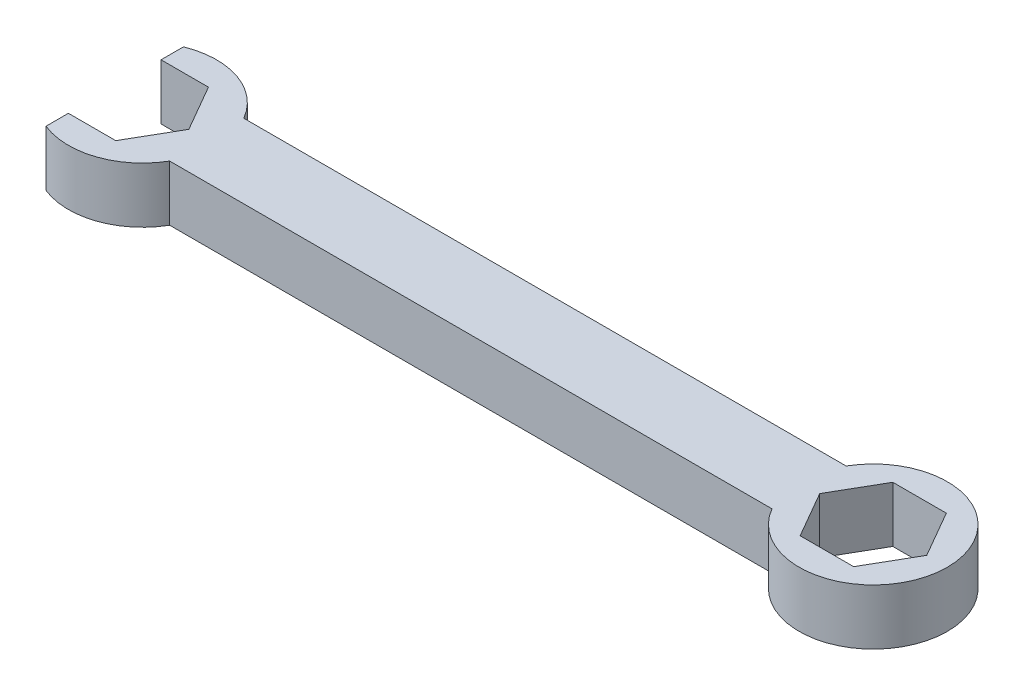
ISO-10303-21;
HEADER;
FILE_DESCRIPTION(('STEP AP214'),'2;1');
FILE_NAME('part.step','',(''),(''),'','','');
FILE_SCHEMA(('AUTOMOTIVE_DESIGN { 1 0 10303 214 1 1 1 1 }'));
ENDSEC;
DATA;
#1=APPLICATION_CONTEXT('core data for automotive mechanical design processes');
#2=APPLICATION_PROTOCOL_DEFINITION('international standard','automotive_design',2000,#1);
#3=PRODUCT_CONTEXT('',#1,'mechanical');
#4=PRODUCT('Part','Part','',(#3));
#5=PRODUCT_RELATED_PRODUCT_CATEGORY('part','',(#4));
#6=PRODUCT_DEFINITION_FORMATION('','',#4);
#7=PRODUCT_DEFINITION_CONTEXT('part definition',#1,'design');
#8=PRODUCT_DEFINITION('design','',#6,#7);
#9=PRODUCT_DEFINITION_SHAPE('','',#8);
#10=(LENGTH_UNIT() NAMED_UNIT(*) SI_UNIT(.MILLI.,.METRE.));
#11=(NAMED_UNIT(*) PLANE_ANGLE_UNIT() SI_UNIT($,.RADIAN.));
#12=(NAMED_UNIT(*) SI_UNIT($,.STERADIAN.) SOLID_ANGLE_UNIT());
#13=UNCERTAINTY_MEASURE_WITH_UNIT(LENGTH_MEASURE(1.E-05),#10,'distance_accuracy_value','');
#14=(GEOMETRIC_REPRESENTATION_CONTEXT(3) GLOBAL_UNCERTAINTY_ASSIGNED_CONTEXT((#13)) GLOBAL_UNIT_ASSIGNED_CONTEXT((#10,
#11,#12)) REPRESENTATION_CONTEXT('',''));
#15=CARTESIAN_POINT('',(0.,0.,0.));
#16=DIRECTION('',(0.,0.,1.));
#17=DIRECTION('',(1.,0.,0.));
#18=AXIS2_PLACEMENT_3D('',#15,#16,#17);
#19=CARTESIAN_POINT('',(-22.6821322748836,7.62,0.));
#20=DIRECTION('',(0.,1.,0.));
#21=DIRECTION('',(0.,0.,1.));
#22=AXIS2_PLACEMENT_3D('',#19,#20,#21);
#23=PLANE('',#22);
#24=DIRECTION('',(0.,0.,1.));
#25=VECTOR('',#24,1.);
#26=CARTESIAN_POINT('',(-26.4921322748836,7.62,-9.41857207861149));
#27=LINE('',#26,#25);
#28=CARTESIAN_POINT('',(-26.4921322748836,7.62,-9.41857207861149));
#29=VERTEX_POINT('',#28);
#30=CARTESIAN_POINT('',(-26.4921322748836,7.62,-6.34999999999999));
#31=VERTEX_POINT('',#30);
#32=EDGE_CURVE('E207',#29,#31,#27,.T.);
#33=ORIENTED_EDGE('',*,*,#32,.T.);
#34=DIRECTION('',(1.,0.,0.));
#35=VECTOR('',#34,1.);
#36=CARTESIAN_POINT('',(-19.9983064842377,7.62,-6.34999999999999));
#37=LINE('',#36,#35);
#38=CARTESIAN_POINT('',(-19.9983064842377,7.62,-6.34999999999999));
#39=VERTEX_POINT('',#38);
#40=EDGE_CURVE('E210',#31,#39,#37,.T.);
#41=ORIENTED_EDGE('',*,*,#40,.T.);
#42=DIRECTION('',(0.5,0.,0.866025403784438));
#43=VECTOR('',#42,1.);
#44=CARTESIAN_POINT('',(-16.3321322748836,7.62,0.));
#45=LINE('',#44,#43);
#46=CARTESIAN_POINT('',(-16.3321322748836,7.62,0.));
#47=VERTEX_POINT('',#46);
#48=EDGE_CURVE('E213',#39,#47,#45,.T.);
#49=ORIENTED_EDGE('',*,*,#48,.T.);
#50=DIRECTION('',(-0.5,0.,0.866025403784439));
#51=VECTOR('',#50,1.);
#52=CARTESIAN_POINT('',(-19.9983064842377,7.62,6.35));
#53=LINE('',#52,#51);
#54=CARTESIAN_POINT('',(-19.9983064842377,7.62,6.35));
#55=VERTEX_POINT('',#54);
#56=EDGE_CURVE('E215',#47,#55,#53,.T.);
#57=ORIENTED_EDGE('',*,*,#56,.T.);
#58=DIRECTION('',(-1.,0.,0.));
#59=VECTOR('',#58,1.);
#60=CARTESIAN_POINT('',(-19.9983064842377,7.62,6.35));
#61=LINE('',#60,#59);
#62=CARTESIAN_POINT('',(-26.4921322748836,7.62,6.35));
#63=VERTEX_POINT('',#62);
#64=EDGE_CURVE('E217',#55,#63,#61,.T.);
#65=ORIENTED_EDGE('',*,*,#64,.T.);
#66=DIRECTION('',(0.,0.,1.));
#67=VECTOR('',#66,1.);
#68=CARTESIAN_POINT('',(-26.4921322748836,7.62,6.35));
#69=LINE('',#68,#67);
#70=CARTESIAN_POINT('',(-26.4921322748836,7.62,9.41857207861149));
#71=VERTEX_POINT('',#70);
#72=EDGE_CURVE('E219',#63,#71,#69,.T.);
#73=ORIENTED_EDGE('',*,*,#72,.T.);
#74=CARTESIAN_POINT('',(-22.6821322748836,7.62,0.));
#75=DIRECTION('',(0.,1.,0.));
#76=DIRECTION('',(0.,0.,1.));
#77=AXIS2_PLACEMENT_3D('',#74,#75,#76);
#78=CIRCLE('',#77,10.16);
#79=CARTESIAN_POINT('',(-13.8833141724337,7.62,5.08));
#80=VERTEX_POINT('',#79);
#81=EDGE_CURVE('E221',#71,#80,#78,.T.);
#82=ORIENTED_EDGE('',*,*,#81,.T.);
#83=DIRECTION('',(1.,0.,0.));
#84=VECTOR('',#83,1.);
#85=CARTESIAN_POINT('',(-13.8833141724337,7.62,5.08));
#86=LINE('',#85,#84);
#87=CARTESIAN_POINT('',(68.6666858275663,7.62,5.07999999999999));
#88=VERTEX_POINT('',#87);
#89=EDGE_CURVE('E223',#80,#88,#86,.T.);
#90=ORIENTED_EDGE('',*,*,#89,.T.);
#91=CARTESIAN_POINT('',(77.4655039300162,7.62,0.));
#92=DIRECTION('',(0.,1.,0.));
#93=DIRECTION('',(0.,0.,1.));
#94=AXIS2_PLACEMENT_3D('',#91,#92,#93);
#95=CIRCLE('',#94,10.16);
#96=CARTESIAN_POINT('',(68.6666858275663,7.62,-5.08000000000002));
#97=VERTEX_POINT('',#96);
#98=EDGE_CURVE('E225',#88,#97,#95,.T.);
#99=ORIENTED_EDGE('',*,*,#98,.T.);
#100=DIRECTION('',(-1.,0.,0.));
#101=VECTOR('',#100,1.);
#102=CARTESIAN_POINT('',(-13.8833141724337,7.62,-5.08));
#103=LINE('',#102,#101);
#104=CARTESIAN_POINT('',(-13.8833141724337,7.62,-5.08));
#105=VERTEX_POINT('',#104);
#106=EDGE_CURVE('E227',#97,#105,#103,.T.);
#107=ORIENTED_EDGE('',*,*,#106,.T.);
#108=CARTESIAN_POINT('',(-22.6821322748836,7.62,0.));
#109=DIRECTION('',(0.,1.,0.));
#110=DIRECTION('',(0.,0.,1.));
#111=AXIS2_PLACEMENT_3D('',#108,#109,#110);
#112=CIRCLE('',#111,10.16);
#113=EDGE_CURVE('E229',#105,#29,#112,.T.);
#114=ORIENTED_EDGE('',*,*,#113,.T.);
#115=EDGE_LOOP('',(#33,#41,#49,#57,#65,#73,#82,#90,#99,#107,#114));
#116=FACE_BOUND('',#115,.T.);
#117=DIRECTION('',(0.499999999999999,0.,0.866025403784439));
#118=VECTOR('',#117,1.);
#119=CARTESIAN_POINT('',(70.1331555113079,7.62,0.));
#120=LINE('',#119,#118);
#121=CARTESIAN_POINT('',(70.1331555113079,7.62,0.));
#122=VERTEX_POINT('',#121);
#123=CARTESIAN_POINT('',(73.7993297206621,7.62,6.34999999999999));
#124=VERTEX_POINT('',#123);
#125=EDGE_CURVE('E164',#122,#124,#120,.T.);
#126=ORIENTED_EDGE('',*,*,#125,.F.);
#127=DIRECTION('',(-0.5,0.,0.866025403784439));
#128=VECTOR('',#127,1.);
#129=CARTESIAN_POINT('',(73.7993297206621,7.62,-6.35000000000001));
#130=LINE('',#129,#128);
#131=CARTESIAN_POINT('',(73.7993297206621,7.62,-6.35000000000001));
#132=VERTEX_POINT('',#131);
#133=EDGE_CURVE('E156',#132,#122,#130,.T.);
#134=ORIENTED_EDGE('',*,*,#133,.F.);
#135=DIRECTION('',(-1.,0.,0.));
#136=VECTOR('',#135,1.);
#137=CARTESIAN_POINT('',(81.1316781393703,7.62,-6.35000000000001));
#138=LINE('',#137,#136);
#139=CARTESIAN_POINT('',(81.1316781393703,7.62,-6.35000000000001));
#140=VERTEX_POINT('',#139);
#141=EDGE_CURVE('E185',#140,#132,#138,.T.);
#142=ORIENTED_EDGE('',*,*,#141,.F.);
#143=DIRECTION('',(-0.5,0.,-0.866025403784439));
#144=VECTOR('',#143,1.);
#145=CARTESIAN_POINT('',(84.7978523487244,7.62,0.));
#146=LINE('',#145,#144);
#147=CARTESIAN_POINT('',(84.7978523487244,7.62,0.));
#148=VERTEX_POINT('',#147);
#149=EDGE_CURVE('E183',#148,#140,#146,.T.);
#150=ORIENTED_EDGE('',*,*,#149,.F.);
#151=DIRECTION('',(0.500000000000001,0.,-0.866025403784438));
#152=VECTOR('',#151,1.);
#153=CARTESIAN_POINT('',(81.1316781393703,7.62,6.34999999999999));
#154=LINE('',#153,#152);
#155=CARTESIAN_POINT('',(81.1316781393703,7.62,6.34999999999999));
#156=VERTEX_POINT('',#155);
#157=EDGE_CURVE('E179',#156,#148,#154,.T.);
#158=ORIENTED_EDGE('',*,*,#157,.F.);
#159=DIRECTION('',(1.,0.,0.));
#160=VECTOR('',#159,1.);
#161=CARTESIAN_POINT('',(73.7993297206621,7.62,6.34999999999999));
#162=LINE('',#161,#160);
#163=EDGE_CURVE('E177',#124,#156,#162,.T.);
#164=ORIENTED_EDGE('',*,*,#163,.F.);
#165=EDGE_LOOP('',(#126,#134,#142,#150,#158,#164));
#166=FACE_BOUND('',#165,.T.);
#167=ADVANCED_FACE('F37',(#116,#166),#23,.T.);
#168=CARTESIAN_POINT('',(-22.6821322748836,0.,0.));
#169=DIRECTION('',(0.,1.,0.));
#170=DIRECTION('',(0.,0.,1.));
#171=AXIS2_PLACEMENT_3D('',#168,#169,#170);
#172=PLANE('',#171);
#173=DIRECTION('',(0.,0.,1.));
#174=VECTOR('',#173,1.);
#175=CARTESIAN_POINT('',(-26.4921322748836,0.,-9.41857207861149));
#176=LINE('',#175,#174);
#177=CARTESIAN_POINT('',(-26.4921322748836,0.,-9.41857207861149));
#178=VERTEX_POINT('',#177);
#179=CARTESIAN_POINT('',(-26.4921322748836,0.,-6.34999999999999));
#180=VERTEX_POINT('',#179);
#181=EDGE_CURVE('E172',#178,#180,#176,.T.);
#182=ORIENTED_EDGE('',*,*,#181,.F.);
#183=CARTESIAN_POINT('',(-22.6821322748836,0.,0.));
#184=DIRECTION('',(0.,1.,0.));
#185=DIRECTION('',(0.,0.,1.));
#186=AXIS2_PLACEMENT_3D('',#183,#184,#185);
#187=CIRCLE('',#186,10.16);
#188=CARTESIAN_POINT('',(-13.8833141724337,0.,-5.08));
#189=VERTEX_POINT('',#188);
#190=EDGE_CURVE('E211',#189,#178,#187,.T.);
#191=ORIENTED_EDGE('',*,*,#190,.F.);
#192=DIRECTION('',(-1.,0.,0.));
#193=VECTOR('',#192,1.);
#194=CARTESIAN_POINT('',(-13.8833141724337,0.,-5.08));
#195=LINE('',#194,#193);
#196=CARTESIAN_POINT('',(68.6666858275663,0.,-5.08000000000002));
#197=VERTEX_POINT('',#196);
#198=EDGE_CURVE('E250',#197,#189,#195,.T.);
#199=ORIENTED_EDGE('',*,*,#198,.F.);
#200=CARTESIAN_POINT('',(77.4655039300162,0.,0.));
#201=DIRECTION('',(0.,1.,0.));
#202=DIRECTION('',(0.,0.,1.));
#203=AXIS2_PLACEMENT_3D('',#200,#201,#202);
#204=CIRCLE('',#203,10.16);
#205=CARTESIAN_POINT('',(68.6666858275663,0.,5.07999999999999));
#206=VERTEX_POINT('',#205);
#207=EDGE_CURVE('E248',#206,#197,#204,.T.);
#208=ORIENTED_EDGE('',*,*,#207,.F.);
#209=DIRECTION('',(1.,0.,0.));
#210=VECTOR('',#209,1.);
#211=CARTESIAN_POINT('',(-13.8833141724337,0.,5.08));
#212=LINE('',#211,#210);
#213=CARTESIAN_POINT('',(-13.8833141724337,0.,5.08));
#214=VERTEX_POINT('',#213);
#215=EDGE_CURVE('E246',#214,#206,#212,.T.);
#216=ORIENTED_EDGE('',*,*,#215,.F.);
#217=CARTESIAN_POINT('',(-22.6821322748836,0.,0.));
#218=DIRECTION('',(0.,1.,0.));
#219=DIRECTION('',(0.,0.,1.));
#220=AXIS2_PLACEMENT_3D('',#217,#218,#219);
#221=CIRCLE('',#220,10.16);
#222=CARTESIAN_POINT('',(-26.4921322748836,0.,9.41857207861149));
#223=VERTEX_POINT('',#222);
#224=EDGE_CURVE('E244',#223,#214,#221,.T.);
#225=ORIENTED_EDGE('',*,*,#224,.F.);
#226=DIRECTION('',(0.,0.,1.));
#227=VECTOR('',#226,1.);
#228=CARTESIAN_POINT('',(-26.4921322748836,0.,6.35));
#229=LINE('',#228,#227);
#230=CARTESIAN_POINT('',(-26.4921322748836,0.,6.35));
#231=VERTEX_POINT('',#230);
#232=EDGE_CURVE('E242',#231,#223,#229,.T.);
#233=ORIENTED_EDGE('',*,*,#232,.F.);
#234=DIRECTION('',(-1.,0.,0.));
#235=VECTOR('',#234,1.);
#236=CARTESIAN_POINT('',(-19.9983064842377,0.,6.35));
#237=LINE('',#236,#235);
#238=CARTESIAN_POINT('',(-19.9983064842377,0.,6.35));
#239=VERTEX_POINT('',#238);
#240=EDGE_CURVE('E240',#239,#231,#237,.T.);
#241=ORIENTED_EDGE('',*,*,#240,.F.);
#242=DIRECTION('',(-0.5,0.,0.866025403784439));
#243=VECTOR('',#242,1.);
#244=CARTESIAN_POINT('',(-19.9983064842377,0.,6.35));
#245=LINE('',#244,#243);
#246=CARTESIAN_POINT('',(-16.3321322748836,0.,0.));
#247=VERTEX_POINT('',#246);
#248=EDGE_CURVE('E238',#247,#239,#245,.T.);
#249=ORIENTED_EDGE('',*,*,#248,.F.);
#250=DIRECTION('',(0.5,0.,0.866025403784438));
#251=VECTOR('',#250,1.);
#252=CARTESIAN_POINT('',(-16.3321322748836,0.,0.));
#253=LINE('',#252,#251);
#254=CARTESIAN_POINT('',(-19.9983064842377,0.,-6.34999999999999));
#255=VERTEX_POINT('',#254);
#256=EDGE_CURVE('E236',#255,#247,#253,.T.);
#257=ORIENTED_EDGE('',*,*,#256,.F.);
#258=DIRECTION('',(1.,0.,0.));
#259=VECTOR('',#258,1.);
#260=CARTESIAN_POINT('',(-19.9983064842377,0.,-6.34999999999999));
#261=LINE('',#260,#259);
#262=EDGE_CURVE('E234',#180,#255,#261,.T.);
#263=ORIENTED_EDGE('',*,*,#262,.F.);
#264=EDGE_LOOP('',(#182,#191,#199,#208,#216,#225,#233,#241,#249,#257,#263));
#265=FACE_BOUND('',#264,.T.);
#266=DIRECTION('',(-0.5,0.,0.866025403784439));
#267=VECTOR('',#266,1.);
#268=CARTESIAN_POINT('',(73.7993297206621,0.,-6.35000000000001));
#269=LINE('',#268,#267);
#270=CARTESIAN_POINT('',(73.7993297206621,0.,-6.35000000000001));
#271=VERTEX_POINT('',#270);
#272=CARTESIAN_POINT('',(70.1331555113079,0.,0.));
#273=VERTEX_POINT('',#272);
#274=EDGE_CURVE('E60',#271,#273,#269,.T.);
#275=ORIENTED_EDGE('',*,*,#274,.T.);
#276=DIRECTION('',(0.499999999999999,0.,0.866025403784439));
#277=VECTOR('',#276,1.);
#278=CARTESIAN_POINT('',(70.1331555113079,0.,0.));
#279=LINE('',#278,#277);
#280=CARTESIAN_POINT('',(73.7993297206621,0.,6.34999999999999));
#281=VERTEX_POINT('',#280);
#282=EDGE_CURVE('E171',#273,#281,#279,.T.);
#283=ORIENTED_EDGE('',*,*,#282,.T.);
#284=DIRECTION('',(1.,0.,0.));
#285=VECTOR('',#284,1.);
#286=CARTESIAN_POINT('',(73.7993297206621,0.,6.34999999999999));
#287=LINE('',#286,#285);
#288=CARTESIAN_POINT('',(81.1316781393703,0.,6.34999999999999));
#289=VERTEX_POINT('',#288);
#290=EDGE_CURVE('E189',#281,#289,#287,.T.);
#291=ORIENTED_EDGE('',*,*,#290,.T.);
#292=DIRECTION('',(0.500000000000001,0.,-0.866025403784438));
#293=VECTOR('',#292,1.);
#294=CARTESIAN_POINT('',(81.1316781393703,0.,6.34999999999999));
#295=LINE('',#294,#293);
#296=CARTESIAN_POINT('',(84.7978523487244,0.,0.));
#297=VERTEX_POINT('',#296);
#298=EDGE_CURVE('E192',#289,#297,#295,.T.);
#299=ORIENTED_EDGE('',*,*,#298,.T.);
#300=DIRECTION('',(-0.5,0.,-0.866025403784439));
#301=VECTOR('',#300,1.);
#302=CARTESIAN_POINT('',(84.7978523487244,0.,0.));
#303=LINE('',#302,#301);
#304=CARTESIAN_POINT('',(81.1316781393703,0.,-6.35000000000001));
#305=VERTEX_POINT('',#304);
#306=EDGE_CURVE('E195',#297,#305,#303,.T.);
#307=ORIENTED_EDGE('',*,*,#306,.T.);
#308=DIRECTION('',(-1.,0.,0.));
#309=VECTOR('',#308,1.);
#310=CARTESIAN_POINT('',(81.1316781393703,0.,-6.35000000000001));
#311=LINE('',#310,#309);
#312=EDGE_CURVE('E165',#305,#271,#311,.T.);
#313=ORIENTED_EDGE('',*,*,#312,.T.);
#314=EDGE_LOOP('',(#275,#283,#291,#299,#307,#313));
#315=FACE_BOUND('',#314,.T.);
#316=ADVANCED_FACE('F289',(#265,#315),#172,.F.);
#317=CARTESIAN_POINT('',(-26.4921322748836,7.62,-9.41857207861149));
#318=DIRECTION('',(1.,0.,0.));
#319=DIRECTION('',(0.,0.,-1.));
#320=AXIS2_PLACEMENT_3D('',#317,#318,#319);
#321=PLANE('',#320);
#322=ORIENTED_EDGE('',*,*,#181,.T.);
#323=DIRECTION('',(0.,-1.,0.));
#324=VECTOR('',#323,1.);
#325=CARTESIAN_POINT('',(-26.4921322748836,7.62,-6.34999999999999));
#326=LINE('',#325,#324);
#327=EDGE_CURVE('E11',#31,#180,#326,.T.);
#328=ORIENTED_EDGE('',*,*,#327,.F.);
#329=ORIENTED_EDGE('',*,*,#32,.F.);
#330=DIRECTION('',(0.,-1.,0.));
#331=VECTOR('',#330,1.);
#332=CARTESIAN_POINT('',(-26.4921322748836,7.62,-9.41857207861149));
#333=LINE('',#332,#331);
#334=EDGE_CURVE('E231',#29,#178,#333,.T.);
#335=ORIENTED_EDGE('',*,*,#334,.T.);
#336=EDGE_LOOP('',(#322,#328,#329,#335));
#337=FACE_BOUND('',#336,.T.);
#338=ADVANCED_FACE('F39',(#337),#321,.F.);
#339=CARTESIAN_POINT('',(-19.9983064842377,7.62,-6.34999999999999));
#340=DIRECTION('',(0.,0.,-1.));
#341=DIRECTION('',(-1.,0.,0.));
#342=AXIS2_PLACEMENT_3D('',#339,#340,#341);
#343=PLANE('',#342);
#344=ORIENTED_EDGE('',*,*,#262,.T.);
#345=DIRECTION('',(0.,-1.,0.));
#346=VECTOR('',#345,1.);
#347=CARTESIAN_POINT('',(-19.9983064842377,7.62,-6.34999999999999));
#348=LINE('',#347,#346);
#349=EDGE_CURVE('E45',#39,#255,#348,.T.);
#350=ORIENTED_EDGE('',*,*,#349,.F.);
#351=ORIENTED_EDGE('',*,*,#40,.F.);
#352=ORIENTED_EDGE('',*,*,#327,.T.);
#353=EDGE_LOOP('',(#344,#350,#351,#352));
#354=FACE_BOUND('',#353,.T.);
#355=ADVANCED_FACE('F306',(#354),#343,.F.);
#356=CARTESIAN_POINT('',(-16.3321322748836,7.62,0.));
#357=DIRECTION('',(0.866025403784438,0.,-0.5));
#358=DIRECTION('',(-0.5,0.,-0.866025403784439));
#359=AXIS2_PLACEMENT_3D('',#356,#357,#358);
#360=PLANE('',#359);
#361=ORIENTED_EDGE('',*,*,#256,.T.);
#362=DIRECTION('',(0.,-1.,0.));
#363=VECTOR('',#362,1.);
#364=CARTESIAN_POINT('',(-16.3321322748836,7.62,0.));
#365=LINE('',#364,#363);
#366=EDGE_CURVE('E276',#47,#247,#365,.T.);
#367=ORIENTED_EDGE('',*,*,#366,.F.);
#368=ORIENTED_EDGE('',*,*,#48,.F.);
#369=ORIENTED_EDGE('',*,*,#349,.T.);
#370=EDGE_LOOP('',(#361,#367,#368,#369));
#371=FACE_BOUND('',#370,.T.);
#372=ADVANCED_FACE('F283',(#371),#360,.F.);
#373=CARTESIAN_POINT('',(-19.9983064842377,7.62,6.35));
#374=DIRECTION('',(0.866025403784439,0.,0.5));
#375=DIRECTION('',(0.5,0.,-0.866025403784439));
#376=AXIS2_PLACEMENT_3D('',#373,#374,#375);
#377=PLANE('',#376);
#378=ORIENTED_EDGE('',*,*,#248,.T.);
#379=DIRECTION('',(0.,-1.,0.));
#380=VECTOR('',#379,1.);
#381=CARTESIAN_POINT('',(-19.9983064842377,7.62,6.35));
#382=LINE('',#381,#380);
#383=EDGE_CURVE('E273',#55,#239,#382,.T.);
#384=ORIENTED_EDGE('',*,*,#383,.F.);
#385=ORIENTED_EDGE('',*,*,#56,.F.);
#386=ORIENTED_EDGE('',*,*,#366,.T.);
#387=EDGE_LOOP('',(#378,#384,#385,#386));
#388=FACE_BOUND('',#387,.T.);
#389=ADVANCED_FACE('F295',(#388),#377,.F.);
#390=CARTESIAN_POINT('',(-19.9983064842377,7.62,6.35));
#391=DIRECTION('',(0.,0.,1.));
#392=DIRECTION('',(1.,0.,0.));
#393=AXIS2_PLACEMENT_3D('',#390,#391,#392);
#394=PLANE('',#393);
#395=ORIENTED_EDGE('',*,*,#240,.T.);
#396=DIRECTION('',(0.,-1.,0.));
#397=VECTOR('',#396,1.);
#398=CARTESIAN_POINT('',(-26.4921322748836,7.62,6.35));
#399=LINE('',#398,#397);
#400=EDGE_CURVE('E270',#63,#231,#399,.T.);
#401=ORIENTED_EDGE('',*,*,#400,.F.);
#402=ORIENTED_EDGE('',*,*,#64,.F.);
#403=ORIENTED_EDGE('',*,*,#383,.T.);
#404=EDGE_LOOP('',(#395,#401,#402,#403));
#405=FACE_BOUND('',#404,.T.);
#406=ADVANCED_FACE('F299',(#405),#394,.F.);
#407=CARTESIAN_POINT('',(-26.4921322748836,7.62,6.35));
#408=DIRECTION('',(1.,0.,0.));
#409=DIRECTION('',(0.,0.,-1.));
#410=AXIS2_PLACEMENT_3D('',#407,#408,#409);
#411=PLANE('',#410);
#412=ORIENTED_EDGE('',*,*,#232,.T.);
#413=DIRECTION('',(0.,-1.,0.));
#414=VECTOR('',#413,1.);
#415=CARTESIAN_POINT('',(-26.4921322748836,7.62,9.41857207861149));
#416=LINE('',#415,#414);
#417=EDGE_CURVE('E267',#71,#223,#416,.T.);
#418=ORIENTED_EDGE('',*,*,#417,.F.);
#419=ORIENTED_EDGE('',*,*,#72,.F.);
#420=ORIENTED_EDGE('',*,*,#400,.T.);
#421=EDGE_LOOP('',(#412,#418,#419,#420));
#422=FACE_BOUND('',#421,.T.);
#423=ADVANCED_FACE('F334',(#422),#411,.F.);
#424=CARTESIAN_POINT('',(-22.6821322748836,7.62,0.));
#425=DIRECTION('',(0.,-1.,0.));
#426=DIRECTION('',(0.,0.,-1.));
#427=AXIS2_PLACEMENT_3D('',#424,#425,#426);
#428=CYLINDRICAL_SURFACE('',#427,10.16);
#429=ORIENTED_EDGE('',*,*,#224,.T.);
#430=DIRECTION('',(0.,-1.,0.));
#431=VECTOR('',#430,1.);
#432=CARTESIAN_POINT('',(-13.8833141724337,7.62,5.08));
#433=LINE('',#432,#431);
#434=EDGE_CURVE('E264',#80,#214,#433,.T.);
#435=ORIENTED_EDGE('',*,*,#434,.F.);
#436=ORIENTED_EDGE('',*,*,#81,.F.);
#437=ORIENTED_EDGE('',*,*,#417,.T.);
#438=EDGE_LOOP('',(#429,#435,#436,#437));
#439=FACE_BOUND('',#438,.T.);
#440=ADVANCED_FACE('F332',(#439),#428,.T.);
#441=CARTESIAN_POINT('',(-13.8833141724337,7.62,5.08));
#442=DIRECTION('',(0.,0.,-1.));
#443=DIRECTION('',(-1.,0.,0.));
#444=AXIS2_PLACEMENT_3D('',#441,#442,#443);
#445=PLANE('',#444);
#446=ORIENTED_EDGE('',*,*,#215,.T.);
#447=DIRECTION('',(0.,-1.,0.));
#448=VECTOR('',#447,1.);
#449=CARTESIAN_POINT('',(68.6666858275663,7.62,5.07999999999999));
#450=LINE('',#449,#448);
#451=EDGE_CURVE('E261',#88,#206,#450,.T.);
#452=ORIENTED_EDGE('',*,*,#451,.F.);
#453=ORIENTED_EDGE('',*,*,#89,.F.);
#454=ORIENTED_EDGE('',*,*,#434,.T.);
#455=EDGE_LOOP('',(#446,#452,#453,#454));
#456=FACE_BOUND('',#455,.T.);
#457=ADVANCED_FACE('F327',(#456),#445,.F.);
#458=CARTESIAN_POINT('',(77.4655039300162,7.62,0.));
#459=DIRECTION('',(0.,-1.,0.));
#460=DIRECTION('',(0.,0.,-1.));
#461=AXIS2_PLACEMENT_3D('',#458,#459,#460);
#462=CYLINDRICAL_SURFACE('',#461,10.16);
#463=ORIENTED_EDGE('',*,*,#207,.T.);
#464=DIRECTION('',(0.,-1.,0.));
#465=VECTOR('',#464,1.);
#466=CARTESIAN_POINT('',(68.6666858275663,7.62,-5.08000000000002));
#467=LINE('',#466,#465);
#468=EDGE_CURVE('E258',#97,#197,#467,.T.);
#469=ORIENTED_EDGE('',*,*,#468,.F.);
#470=ORIENTED_EDGE('',*,*,#98,.F.);
#471=ORIENTED_EDGE('',*,*,#451,.T.);
#472=EDGE_LOOP('',(#463,#469,#470,#471));
#473=FACE_BOUND('',#472,.T.);
#474=ADVANCED_FACE('F322',(#473),#462,.T.);
#475=CARTESIAN_POINT('',(-13.8833141724337,7.62,-5.08));
#476=DIRECTION('',(0.,0.,1.));
#477=DIRECTION('',(1.,0.,0.));
#478=AXIS2_PLACEMENT_3D('',#475,#476,#477);
#479=PLANE('',#478);
#480=ORIENTED_EDGE('',*,*,#198,.T.);
#481=DIRECTION('',(0.,-1.,0.));
#482=VECTOR('',#481,1.);
#483=CARTESIAN_POINT('',(-13.8833141724337,7.62,-5.08));
#484=LINE('',#483,#482);
#485=EDGE_CURVE('E255',#105,#189,#484,.T.);
#486=ORIENTED_EDGE('',*,*,#485,.F.);
#487=ORIENTED_EDGE('',*,*,#106,.F.);
#488=ORIENTED_EDGE('',*,*,#468,.T.);
#489=EDGE_LOOP('',(#480,#486,#487,#488));
#490=FACE_BOUND('',#489,.T.);
#491=ADVANCED_FACE('F318',(#490),#479,.F.);
#492=CARTESIAN_POINT('',(-22.6821322748836,7.62,0.));
#493=DIRECTION('',(0.,-1.,0.));
#494=DIRECTION('',(0.,0.,-1.));
#495=AXIS2_PLACEMENT_3D('',#492,#493,#494);
#496=CYLINDRICAL_SURFACE('',#495,10.16);
#497=ORIENTED_EDGE('',*,*,#190,.T.);
#498=ORIENTED_EDGE('',*,*,#334,.F.);
#499=ORIENTED_EDGE('',*,*,#113,.F.);
#500=ORIENTED_EDGE('',*,*,#485,.T.);
#501=EDGE_LOOP('',(#497,#498,#499,#500));
#502=FACE_BOUND('',#501,.T.);
#503=ADVANCED_FACE('F313',(#502),#496,.T.);
#504=CARTESIAN_POINT('',(73.7993297206621,7.62,-6.35000000000001));
#505=DIRECTION('',(0.866025403784439,0.,0.5));
#506=DIRECTION('',(0.5,0.,-0.866025403784439));
#507=AXIS2_PLACEMENT_3D('',#504,#505,#506);
#508=PLANE('',#507);
#509=ORIENTED_EDGE('',*,*,#274,.F.);
#510=DIRECTION('',(0.,-1.,0.));
#511=VECTOR('',#510,1.);
#512=CARTESIAN_POINT('',(73.7993297206621,7.62,-6.35000000000001));
#513=LINE('',#512,#511);
#514=EDGE_CURVE('E160',#132,#271,#513,.T.);
#515=ORIENTED_EDGE('',*,*,#514,.F.);
#516=ORIENTED_EDGE('',*,*,#133,.T.);
#517=DIRECTION('',(0.,-1.,0.));
#518=VECTOR('',#517,1.);
#519=CARTESIAN_POINT('',(70.1331555113079,7.62,0.));
#520=LINE('',#519,#518);
#521=EDGE_CURVE('E159',#122,#273,#520,.T.);
#522=ORIENTED_EDGE('',*,*,#521,.T.);
#523=EDGE_LOOP('',(#509,#515,#516,#522));
#524=FACE_BOUND('',#523,.T.);
#525=ADVANCED_FACE('F158',(#524),#508,.T.);
#526=CARTESIAN_POINT('',(70.1331555113079,7.62,0.));
#527=DIRECTION('',(0.866025403784439,0.,-0.499999999999999));
#528=DIRECTION('',(-0.499999999999999,0.,-0.866025403784439));
#529=AXIS2_PLACEMENT_3D('',#526,#527,#528);
#530=PLANE('',#529);
#531=ORIENTED_EDGE('',*,*,#282,.F.);
#532=ORIENTED_EDGE('',*,*,#521,.F.);
#533=ORIENTED_EDGE('',*,*,#125,.T.);
#534=DIRECTION('',(0.,-1.,0.));
#535=VECTOR('',#534,1.);
#536=CARTESIAN_POINT('',(73.7993297206621,7.62,6.34999999999999));
#537=LINE('',#536,#535);
#538=EDGE_CURVE('E173',#124,#281,#537,.T.);
#539=ORIENTED_EDGE('',*,*,#538,.T.);
#540=EDGE_LOOP('',(#531,#532,#533,#539));
#541=FACE_BOUND('',#540,.T.);
#542=ADVANCED_FACE('F168',(#541),#530,.T.);
#543=CARTESIAN_POINT('',(73.7993297206621,7.62,6.34999999999999));
#544=DIRECTION('',(0.,0.,-1.));
#545=DIRECTION('',(-1.,0.,0.));
#546=AXIS2_PLACEMENT_3D('',#543,#544,#545);
#547=PLANE('',#546);
#548=ORIENTED_EDGE('',*,*,#290,.F.);
#549=ORIENTED_EDGE('',*,*,#538,.F.);
#550=ORIENTED_EDGE('',*,*,#163,.T.);
#551=DIRECTION('',(0.,-1.,0.));
#552=VECTOR('',#551,1.);
#553=CARTESIAN_POINT('',(81.1316781393703,7.62,6.34999999999999));
#554=LINE('',#553,#552);
#555=EDGE_CURVE('E204',#156,#289,#554,.T.);
#556=ORIENTED_EDGE('',*,*,#555,.T.);
#557=EDGE_LOOP('',(#548,#549,#550,#556));
#558=FACE_BOUND('',#557,.T.);
#559=ADVANCED_FACE('F386',(#558),#547,.T.);
#560=CARTESIAN_POINT('',(81.1316781393703,7.62,6.34999999999999));
#561=DIRECTION('',(-0.866025403784438,0.,-0.500000000000001));
#562=DIRECTION('',(-0.500000000000001,0.,0.866025403784438));
#563=AXIS2_PLACEMENT_3D('',#560,#561,#562);
#564=PLANE('',#563);
#565=ORIENTED_EDGE('',*,*,#298,.F.);
#566=ORIENTED_EDGE('',*,*,#555,.F.);
#567=ORIENTED_EDGE('',*,*,#157,.T.);
#568=DIRECTION('',(0.,-1.,0.));
#569=VECTOR('',#568,1.);
#570=CARTESIAN_POINT('',(84.7978523487244,7.62,0.));
#571=LINE('',#570,#569);
#572=EDGE_CURVE('E202',#148,#297,#571,.T.);
#573=ORIENTED_EDGE('',*,*,#572,.T.);
#574=EDGE_LOOP('',(#565,#566,#567,#573));
#575=FACE_BOUND('',#574,.T.);
#576=ADVANCED_FACE('F392',(#575),#564,.T.);
#577=CARTESIAN_POINT('',(84.7978523487244,7.62,0.));
#578=DIRECTION('',(-0.866025403784439,0.,0.5));
#579=DIRECTION('',(0.5,0.,0.866025403784439));
#580=AXIS2_PLACEMENT_3D('',#577,#578,#579);
#581=PLANE('',#580);
#582=ORIENTED_EDGE('',*,*,#306,.F.);
#583=ORIENTED_EDGE('',*,*,#572,.F.);
#584=ORIENTED_EDGE('',*,*,#149,.T.);
#585=DIRECTION('',(0.,-1.,0.));
#586=VECTOR('',#585,1.);
#587=CARTESIAN_POINT('',(81.1316781393703,7.62,-6.35000000000001));
#588=LINE('',#587,#586);
#589=EDGE_CURVE('E52',#140,#305,#588,.T.);
#590=ORIENTED_EDGE('',*,*,#589,.T.);
#591=EDGE_LOOP('',(#582,#583,#584,#590));
#592=FACE_BOUND('',#591,.T.);
#593=ADVANCED_FACE('F400',(#592),#581,.T.);
#594=CARTESIAN_POINT('',(81.1316781393703,7.62,-6.35000000000001));
#595=DIRECTION('',(0.,0.,1.));
#596=DIRECTION('',(1.,0.,0.));
#597=AXIS2_PLACEMENT_3D('',#594,#595,#596);
#598=PLANE('',#597);
#599=ORIENTED_EDGE('',*,*,#312,.F.);
#600=ORIENTED_EDGE('',*,*,#589,.F.);
#601=ORIENTED_EDGE('',*,*,#141,.T.);
#602=ORIENTED_EDGE('',*,*,#514,.T.);
#603=EDGE_LOOP('',(#599,#600,#601,#602));
#604=FACE_BOUND('',#603,.T.);
#605=ADVANCED_FACE('F408',(#604),#598,.T.);
#606=CLOSED_SHELL('',(#167,#316,#338,#355,#372,#389,#406,#423,#440,#457,#474,#491,#503,#525,
#542,#559,#576,#593,#605));
#607=MANIFOLD_SOLID_BREP('B2',#606);
#608=ADVANCED_BREP_SHAPE_REPRESENTATION('',(#18,#607),#14);
#609=SHAPE_DEFINITION_REPRESENTATION(#9,#608);
ENDSEC;
END-ISO-10303-21;
